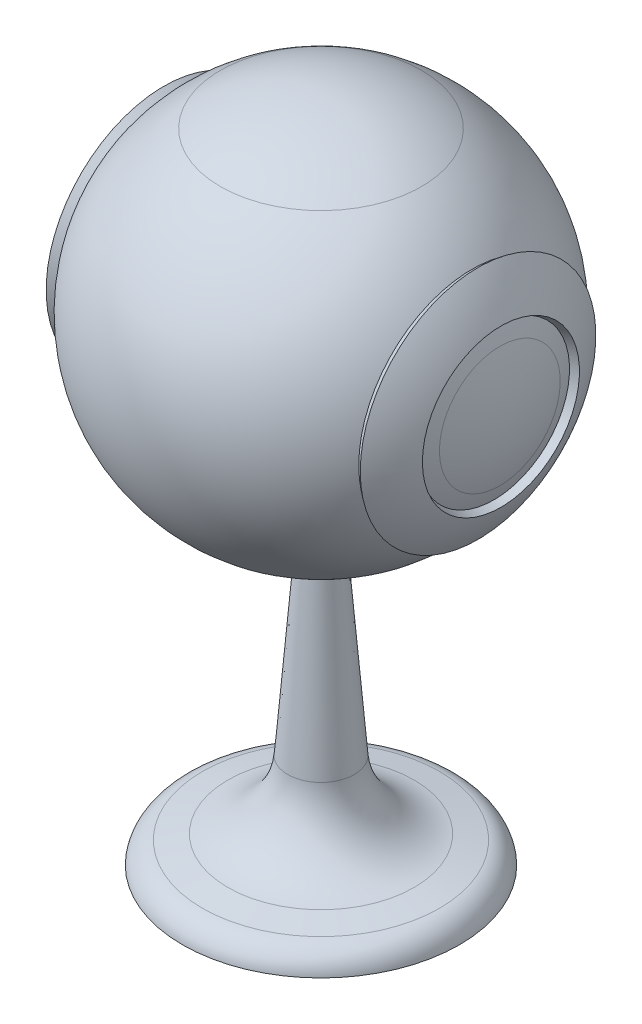
ISO-10303-21;
HEADER;
FILE_DESCRIPTION(('STEP AP214'),'2;1');
FILE_NAME('part.step','',(''),(''),'','','');
FILE_SCHEMA(('AUTOMOTIVE_DESIGN { 1 0 10303 214 1 1 1 1 }'));
ENDSEC;
DATA;
#1=APPLICATION_CONTEXT('core data for automotive mechanical design processes');
#2=APPLICATION_PROTOCOL_DEFINITION('international standard','automotive_design',2000,#1);
#3=PRODUCT_CONTEXT('',#1,'mechanical');
#4=PRODUCT('Part','Part','',(#3));
#5=PRODUCT_RELATED_PRODUCT_CATEGORY('part','',(#4));
#6=PRODUCT_DEFINITION_FORMATION('','',#4);
#7=PRODUCT_DEFINITION_CONTEXT('part definition',#1,'design');
#8=PRODUCT_DEFINITION('design','',#6,#7);
#9=PRODUCT_DEFINITION_SHAPE('','',#8);
#10=(LENGTH_UNIT() NAMED_UNIT(*) SI_UNIT(.MILLI.,.METRE.));
#11=(NAMED_UNIT(*) PLANE_ANGLE_UNIT() SI_UNIT($,.RADIAN.));
#12=(NAMED_UNIT(*) SI_UNIT($,.STERADIAN.) SOLID_ANGLE_UNIT());
#13=UNCERTAINTY_MEASURE_WITH_UNIT(LENGTH_MEASURE(1.E-05),#10,'distance_accuracy_value','');
#14=(GEOMETRIC_REPRESENTATION_CONTEXT(3) GLOBAL_UNCERTAINTY_ASSIGNED_CONTEXT((#13)) GLOBAL_UNIT_ASSIGNED_CONTEXT((#10,
#11,#12)) REPRESENTATION_CONTEXT('',''));
#15=CARTESIAN_POINT('',(0.,0.,0.));
#16=DIRECTION('',(0.,0.,1.));
#17=DIRECTION('',(1.,0.,0.));
#18=AXIS2_PLACEMENT_3D('',#15,#16,#17);
#19=CARTESIAN_POINT('',(-24.96,0.,0.));
#20=DIRECTION('',(-1.,0.,0.));
#21=DIRECTION('',(0.,0.,1.));
#22=AXIS2_PLACEMENT_3D('',#19,#20,#21);
#23=CONICAL_SURFACE('',#22,18.72,0.643501108793285);
#24=CARTESIAN_POINT('',(-24.,0.,0.));
#25=DIRECTION('',(1.,0.,0.));
#26=DIRECTION('',(0.,0.,-1.));
#27=AXIS2_PLACEMENT_3D('',#24,#25,#26);
#28=CIRCLE('',#27,18.);
#29=CARTESIAN_POINT('',(-24.,0.,-18.));
#30=VERTEX_POINT('',#29);
#31=EDGE_CURVE('E62',#30,#30,#28,.F.);
#32=ORIENTED_EDGE('',*,*,#31,.T.);
#33=EDGE_LOOP('',(#32));
#34=FACE_BOUND('',#33,.T.);
#35=CARTESIAN_POINT('',(-24.96,0.,0.));
#36=DIRECTION('',(1.,0.,0.));
#37=DIRECTION('',(0.,0.,-1.));
#38=AXIS2_PLACEMENT_3D('',#35,#36,#37);
#39=CIRCLE('',#38,18.72);
#40=CARTESIAN_POINT('',(-24.96,0.,-18.72));
#41=VERTEX_POINT('',#40);
#42=EDGE_CURVE('E68',#41,#41,#39,.F.);
#43=ORIENTED_EDGE('',*,*,#42,.F.);
#44=EDGE_LOOP('',(#43));
#45=FACE_BOUND('',#44,.T.);
#46=ADVANCED_FACE('F54',(#34,#45),#23,.T.);
#47=CARTESIAN_POINT('',(-28.5952723365244,0.,0.));
#48=DIRECTION('',(-1.,0.,0.));
#49=DIRECTION('',(0.,0.,1.));
#50=AXIS2_PLACEMENT_3D('',#47,#48,#49);
#51=CONICAL_SURFACE('',#50,12.48,0.411516846067488);
#52=CARTESIAN_POINT('',(-27.495454169735,0.,0.));
#53=DIRECTION('',(1.,0.,0.));
#54=DIRECTION('',(0.,0.,-1.));
#55=AXIS2_PLACEMENT_3D('',#52,#53,#54);
#56=CIRCLE('',#55,12.);
#57=CARTESIAN_POINT('',(-27.495454169735,0.,-12.));
#58=VERTEX_POINT('',#57);
#59=EDGE_CURVE('E11',#58,#58,#56,.F.);
#60=ORIENTED_EDGE('',*,*,#59,.F.);
#61=EDGE_LOOP('',(#60));
#62=FACE_BOUND('',#61,.T.);
#63=CARTESIAN_POINT('',(-28.5952723365244,0.,0.));
#64=DIRECTION('',(1.,0.,0.));
#65=DIRECTION('',(0.,0.,-1.));
#66=AXIS2_PLACEMENT_3D('',#63,#64,#65);
#67=CIRCLE('',#66,12.48);
#68=CARTESIAN_POINT('',(-28.5952723365244,0.,-12.48));
#69=VERTEX_POINT('',#68);
#70=EDGE_CURVE('E58',#69,#69,#67,.F.);
#71=ORIENTED_EDGE('',*,*,#70,.T.);
#72=EDGE_LOOP('',(#71));
#73=FACE_BOUND('',#72,.T.);
#74=ADVANCED_FACE('F56',(#62,#73),#51,.F.);
#75=CARTESIAN_POINT('',(0.,0.,0.));
#76=DIRECTION('',(0.,-1.,0.));
#77=DIRECTION('',(0.,0.,-1.));
#78=AXIS2_PLACEMENT_3D('',#75,#76,#77);
#79=SPHERICAL_SURFACE('',#78,30.);
#80=CARTESIAN_POINT('',(0.,0.,0.));
#81=DIRECTION('',(1.,0.,0.));
#82=DIRECTION('',(0.,0.,-1.));
#83=AXIS2_PLACEMENT_3D('',#80,#81,#82);
#84=SPHERICAL_SURFACE('',#83,30.);
#85=ORIENTED_EDGE('',*,*,#31,.F.);
#86=EDGE_LOOP('',(#85));
#87=FACE_BOUND('',#86,.T.);
#88=ORIENTED_EDGE('',*,*,#59,.T.);
#89=EDGE_LOOP('',(#88));
#90=FACE_BOUND('',#89,.T.);
#91=ADVANCED_FACE('F78',(#87,#90),#84,.F.);
#92=CARTESIAN_POINT('',(0.,0.,0.));
#93=DIRECTION('',(0.,-1.,0.));
#94=DIRECTION('',(0.,0.,-1.));
#95=AXIS2_PLACEMENT_3D('',#92,#93,#94);
#96=SPHERICAL_SURFACE('',#95,31.2);
#97=CARTESIAN_POINT('',(0.,0.,0.));
#98=DIRECTION('',(1.,0.,0.));
#99=DIRECTION('',(0.,0.,-1.));
#100=AXIS2_PLACEMENT_3D('',#97,#98,#99);
#101=SPHERICAL_SURFACE('',#100,31.2);
#102=ORIENTED_EDGE('',*,*,#42,.T.);
#103=EDGE_LOOP('',(#102));
#104=FACE_BOUND('',#103,.T.);
#105=ORIENTED_EDGE('',*,*,#70,.F.);
#106=EDGE_LOOP('',(#105));
#107=FACE_BOUND('',#106,.T.);
#108=ADVANCED_FACE('F76',(#104,#107),#101,.T.);
#109=CLOSED_SHELL('',(#46,#74,#91,#108));
#110=MANIFOLD_SOLID_BREP('B2',#109);
#111=CARTESIAN_POINT('',(0.,-76.,-22.));
#112=DIRECTION('',(0.,1.,0.));
#113=DIRECTION('',(0.,0.,1.));
#114=AXIS2_PLACEMENT_3D('',#111,#112,#113);
#115=PLANE('',#114);
#116=CARTESIAN_POINT('',(0.,-76.,0.));
#117=DIRECTION('',(0.,1.,0.));
#118=DIRECTION('',(0.,0.,1.));
#119=AXIS2_PLACEMENT_3D('',#116,#117,#118);
#120=CIRCLE('',#119,22.);
#121=CARTESIAN_POINT('',(0.,-76.,22.));
#122=VERTEX_POINT('',#121);
#123=EDGE_CURVE('E158',#122,#122,#120,.T.);
#124=ORIENTED_EDGE('',*,*,#123,.F.);
#125=EDGE_LOOP('',(#124));
#126=FACE_BOUND('',#125,.T.);
#127=ADVANCED_FACE('F138',(#126),#115,.F.);
#128=CARTESIAN_POINT('',(0.,-73.2,0.));
#129=DIRECTION('',(0.,-1.,0.));
#130=DIRECTION('',(0.,0.,-1.));
#131=AXIS2_PLACEMENT_3D('',#128,#129,#130);
#132=CONICAL_SURFACE('',#131,22.,1.36554355560098);
#133=CARTESIAN_POINT('',(0.,-71.7009181001644,0.));
#134=DIRECTION('',(0.,-1.,0.));
#135=DIRECTION('',(0.,0.,-1.));
#136=AXIS2_PLACEMENT_3D('',#133,#134,#135);
#137=CIRCLE('',#136,14.7992637027171);
#138=CARTESIAN_POINT('',(0.,-71.7009181001644,-14.7992637027171));
#139=VERTEX_POINT('',#138);
#140=EDGE_CURVE('E52',#139,#139,#137,.T.);
#141=ORIENTED_EDGE('',*,*,#140,.T.);
#142=EDGE_LOOP('',(#141));
#143=FACE_BOUND('',#142,.T.);
#144=CARTESIAN_POINT('',(0.,-72.5424751252405,0.));
#145=DIRECTION('',(0.,1.,0.));
#146=DIRECTION('',(0.,0.,1.));
#147=AXIS2_PLACEMENT_3D('',#144,#145,#146);
#148=CIRCLE('',#147,18.8416247087192);
#149=CARTESIAN_POINT('',(0.,-72.5424751252405,18.8416247087192));
#150=VERTEX_POINT('',#149);
#151=EDGE_CURVE('E161',#150,#150,#148,.T.);
#152=ORIENTED_EDGE('',*,*,#151,.T.);
#153=EDGE_LOOP('',(#152));
#154=FACE_BOUND('',#153,.T.);
#155=ADVANCED_FACE('F177',(#143,#154),#132,.T.);
#156=CARTESIAN_POINT('',(0.,-69.8690475241512,0.));
#157=DIRECTION('',(0.,-1.,0.));
#158=DIRECTION('',(0.,0.,-1.));
#159=AXIS2_PLACEMENT_3D('',#156,#157,#158);
#160=CONICAL_SURFACE('',#159,6.00000000000001,0.0798299857122373);
#161=CARTESIAN_POINT('',(0.,-60.9097467996196,0.));
#162=DIRECTION('',(0.,-1.,0.));
#163=DIRECTION('',(0.,0.,-1.));
#164=AXIS2_PLACEMENT_3D('',#161,#162,#163);
#165=CIRCLE('',#164,5.28325594203748);
#166=CARTESIAN_POINT('',(0.,-60.9097467996196,-5.28325594203748));
#167=VERTEX_POINT('',#166);
#168=EDGE_CURVE('E145',#167,#167,#165,.F.);
#169=ORIENTED_EDGE('',*,*,#168,.T.);
#170=EDGE_LOOP('',(#169));
#171=FACE_BOUND('',#170,.T.);
#172=CARTESIAN_POINT('',(0.,-29.8690475241511,0.));
#173=DIRECTION('',(0.,1.,0.));
#174=DIRECTION('',(0.,0.,1.));
#175=AXIS2_PLACEMENT_3D('',#172,#173,#174);
#176=CIRCLE('',#175,2.80000000000001);
#177=CARTESIAN_POINT('',(0.,-29.8690475241511,2.80000000000001));
#178=VERTEX_POINT('',#177);
#179=EDGE_CURVE('E156',#178,#178,#176,.T.);
#180=ORIENTED_EDGE('',*,*,#179,.F.);
#181=EDGE_LOOP('',(#180));
#182=FACE_BOUND('',#181,.T.);
#183=ADVANCED_FACE('F152',(#171,#182),#160,.T.);
#184=CARTESIAN_POINT('',(0.,-29.8690475241511,0.));
#185=DIRECTION('',(0.,1.,0.));
#186=DIRECTION('',(0.,0.,1.));
#187=AXIS2_PLACEMENT_3D('',#184,#185,#186);
#188=CONICAL_SURFACE('',#187,2.80000000000001,1.52406164006435);
#189=CARTESIAN_POINT('',(0.,-30.,0.));
#190=VERTEX_POINT('',#189);
#191=VERTEX_LOOP('',#190);
#192=FACE_BOUND('',#191,.T.);
#193=ORIENTED_EDGE('',*,*,#179,.T.);
#194=EDGE_LOOP('',(#193));
#195=FACE_BOUND('',#194,.T.);
#196=ADVANCED_FACE('F148',(#192,#195),#188,.F.);
#197=CARTESIAN_POINT('',(0.,-76.4585131145537,0.));
#198=DIRECTION('',(0.,-1.,0.));
#199=DIRECTION('',(0.,0.,-1.));
#200=AXIS2_PLACEMENT_3D('',#197,#198,#199);
#201=TOROIDAL_SURFACE('',#200,18.0263661814679,4.);
#202=ORIENTED_EDGE('',*,*,#123,.T.);
#203=EDGE_LOOP('',(#202));
#204=FACE_BOUND('',#203,.T.);
#205=ORIENTED_EDGE('',*,*,#151,.F.);
#206=EDGE_LOOP('',(#205));
#207=FACE_BOUND('',#206,.T.);
#208=ADVANCED_FACE('F151',(#204,#207),#201,.T.);
#209=CARTESIAN_POINT('',(0.,-59.9528041322249,0.));
#210=DIRECTION('',(0.,1.,0.));
#211=DIRECTION('',(0.,0.,1.));
#212=AXIS2_PLACEMENT_3D('',#209,#210,#211);
#213=TOROIDAL_SURFACE('',#212,17.245039284471,12.);
#214=ORIENTED_EDGE('',*,*,#140,.F.);
#215=EDGE_LOOP('',(#214));
#216=FACE_BOUND('',#215,.T.);
#217=ORIENTED_EDGE('',*,*,#168,.F.);
#218=EDGE_LOOP('',(#217));
#219=FACE_BOUND('',#218,.T.);
#220=ADVANCED_FACE('F140',(#216,#219),#213,.F.);
#221=CLOSED_SHELL('',(#127,#155,#183,#196,#208,#220));
#222=MANIFOLD_SOLID_BREP('B6',#221);
#223=CARTESIAN_POINT('',(24.96,0.,0.));
#224=DIRECTION('',(1.,0.,0.));
#225=DIRECTION('',(0.,0.,-1.));
#226=AXIS2_PLACEMENT_3D('',#223,#224,#225);
#227=CONICAL_SURFACE('',#226,18.72,0.643501108793285);
#228=CARTESIAN_POINT('',(24.,0.,0.));
#229=DIRECTION('',(-1.,0.,0.));
#230=DIRECTION('',(0.,0.,1.));
#231=AXIS2_PLACEMENT_3D('',#228,#229,#230);
#232=CIRCLE('',#231,18.);
#233=CARTESIAN_POINT('',(24.,0.,18.));
#234=VERTEX_POINT('',#233);
#235=EDGE_CURVE('E251',#234,#234,#232,.F.);
#236=ORIENTED_EDGE('',*,*,#235,.T.);
#237=EDGE_LOOP('',(#236));
#238=FACE_BOUND('',#237,.T.);
#239=CARTESIAN_POINT('',(24.96,0.,0.));
#240=DIRECTION('',(-1.,0.,0.));
#241=DIRECTION('',(0.,0.,1.));
#242=AXIS2_PLACEMENT_3D('',#239,#240,#241);
#243=CIRCLE('',#242,18.72);
#244=CARTESIAN_POINT('',(24.96,0.,18.72));
#245=VERTEX_POINT('',#244);
#246=EDGE_CURVE('E257',#245,#245,#243,.F.);
#247=ORIENTED_EDGE('',*,*,#246,.F.);
#248=EDGE_LOOP('',(#247));
#249=FACE_BOUND('',#248,.T.);
#250=ADVANCED_FACE('F243',(#238,#249),#227,.T.);
#251=CARTESIAN_POINT('',(28.5952723365244,0.,0.));
#252=DIRECTION('',(1.,0.,0.));
#253=DIRECTION('',(0.,0.,-1.));
#254=AXIS2_PLACEMENT_3D('',#251,#252,#253);
#255=CONICAL_SURFACE('',#254,12.48,0.411516846067488);
#256=CARTESIAN_POINT('',(27.495454169735,0.,0.));
#257=DIRECTION('',(-1.,0.,0.));
#258=DIRECTION('',(0.,0.,1.));
#259=AXIS2_PLACEMENT_3D('',#256,#257,#258);
#260=CIRCLE('',#259,12.);
#261=CARTESIAN_POINT('',(27.495454169735,0.,12.));
#262=VERTEX_POINT('',#261);
#263=EDGE_CURVE('E137',#262,#262,#260,.F.);
#264=ORIENTED_EDGE('',*,*,#263,.F.);
#265=EDGE_LOOP('',(#264));
#266=FACE_BOUND('',#265,.T.);
#267=CARTESIAN_POINT('',(28.5952723365244,0.,0.));
#268=DIRECTION('',(-1.,0.,0.));
#269=DIRECTION('',(0.,0.,1.));
#270=AXIS2_PLACEMENT_3D('',#267,#268,#269);
#271=CIRCLE('',#270,12.48);
#272=CARTESIAN_POINT('',(28.5952723365244,0.,12.48));
#273=VERTEX_POINT('',#272);
#274=EDGE_CURVE('E247',#273,#273,#271,.F.);
#275=ORIENTED_EDGE('',*,*,#274,.T.);
#276=EDGE_LOOP('',(#275));
#277=FACE_BOUND('',#276,.T.);
#278=ADVANCED_FACE('F245',(#266,#277),#255,.F.);
#279=CARTESIAN_POINT('',(0.,0.,0.));
#280=DIRECTION('',(0.,-1.,0.));
#281=DIRECTION('',(0.,0.,-1.));
#282=AXIS2_PLACEMENT_3D('',#279,#280,#281);
#283=SPHERICAL_SURFACE('',#282,30.);
#284=CARTESIAN_POINT('',(0.,0.,0.));
#285=DIRECTION('',(-1.,0.,0.));
#286=DIRECTION('',(0.,0.,1.));
#287=AXIS2_PLACEMENT_3D('',#284,#285,#286);
#288=SPHERICAL_SURFACE('',#287,30.);
#289=ORIENTED_EDGE('',*,*,#235,.F.);
#290=EDGE_LOOP('',(#289));
#291=FACE_BOUND('',#290,.T.);
#292=ORIENTED_EDGE('',*,*,#263,.T.);
#293=EDGE_LOOP('',(#292));
#294=FACE_BOUND('',#293,.T.);
#295=ADVANCED_FACE('F267',(#291,#294),#288,.F.);
#296=CARTESIAN_POINT('',(0.,0.,0.));
#297=DIRECTION('',(0.,-1.,0.));
#298=DIRECTION('',(0.,0.,-1.));
#299=AXIS2_PLACEMENT_3D('',#296,#297,#298);
#300=SPHERICAL_SURFACE('',#299,31.2);
#301=CARTESIAN_POINT('',(0.,0.,0.));
#302=DIRECTION('',(-1.,0.,0.));
#303=DIRECTION('',(0.,0.,1.));
#304=AXIS2_PLACEMENT_3D('',#301,#302,#303);
#305=SPHERICAL_SURFACE('',#304,31.2);
#306=ORIENTED_EDGE('',*,*,#246,.T.);
#307=EDGE_LOOP('',(#306));
#308=FACE_BOUND('',#307,.T.);
#309=ORIENTED_EDGE('',*,*,#274,.F.);
#310=EDGE_LOOP('',(#309));
#311=FACE_BOUND('',#310,.T.);
#312=ADVANCED_FACE('F265',(#308,#311),#305,.T.);
#313=CLOSED_SHELL('',(#250,#278,#295,#312));
#314=MANIFOLD_SOLID_BREP('B46',#313);
#315=CARTESIAN_POINT('',(0.,0.,0.));
#316=DIRECTION('',(0.,-1.,0.));
#317=DIRECTION('',(0.,0.,-1.));
#318=AXIS2_PLACEMENT_3D('',#315,#316,#317);
#319=SPHERICAL_SURFACE('',#318,30.);
#320=CARTESIAN_POINT('',(0.,25.377155080899,0.));
#321=DIRECTION('',(0.,-1.,0.));
#322=DIRECTION('',(0.,0.,-1.));
#323=AXIS2_PLACEMENT_3D('',#320,#321,#322);
#324=CIRCLE('',#323,16.);
#325=CARTESIAN_POINT('',(0.,25.377155080899,-16.));
#326=VERTEX_POINT('',#325);
#327=EDGE_CURVE('E242',#326,#326,#324,.T.);
#328=ORIENTED_EDGE('',*,*,#327,.T.);
#329=EDGE_LOOP('',(#328));
#330=FACE_BOUND('',#329,.T.);
#331=ADVANCED_FACE('F330',(#330),#319,.F.);
#332=CARTESIAN_POINT('',(0.,0.,0.));
#333=DIRECTION('',(1.,0.,0.));
#334=DIRECTION('',(0.,0.,-1.));
#335=AXIS2_PLACEMENT_3D('',#332,#333,#334);
#336=SPHERICAL_SURFACE('',#335,30.);
#337=CARTESIAN_POINT('',(-27.495454169735,0.,0.));
#338=DIRECTION('',(1.,0.,0.));
#339=DIRECTION('',(0.,0.,-1.));
#340=AXIS2_PLACEMENT_3D('',#337,#338,#339);
#341=CIRCLE('',#340,12.);
#342=CARTESIAN_POINT('',(-27.495454169735,0.,-12.));
#343=VERTEX_POINT('',#342);
#344=EDGE_CURVE('E351',#343,#343,#341,.F.);
#345=ORIENTED_EDGE('',*,*,#344,.F.);
#346=EDGE_LOOP('',(#345));
#347=FACE_BOUND('',#346,.T.);
#348=CARTESIAN_POINT('',(-28.4225262775848,0.,0.));
#349=DIRECTION('',(1.,0.,0.));
#350=DIRECTION('',(0.,0.,-1.));
#351=AXIS2_PLACEMENT_3D('',#348,#349,#350);
#352=CIRCLE('',#351,9.6);
#353=CARTESIAN_POINT('',(-28.4225262775848,0.,-9.6));
#354=VERTEX_POINT('',#353);
#355=EDGE_CURVE('E336',#354,#354,#352,.F.);
#356=ORIENTED_EDGE('',*,*,#355,.T.);
#357=EDGE_LOOP('',(#356));
#358=FACE_BOUND('',#357,.T.);
#359=ADVANCED_FACE('F381',(#347,#358),#336,.F.);
#360=CARTESIAN_POINT('',(0.,0.,0.));
#361=DIRECTION('',(-1.,0.,0.));
#362=DIRECTION('',(0.,0.,1.));
#363=AXIS2_PLACEMENT_3D('',#360,#361,#362);
#364=SPHERICAL_SURFACE('',#363,30.);
#365=CARTESIAN_POINT('',(27.495454169735,0.,0.));
#366=DIRECTION('',(-1.,0.,0.));
#367=DIRECTION('',(0.,0.,1.));
#368=AXIS2_PLACEMENT_3D('',#365,#366,#367);
#369=CIRCLE('',#368,12.);
#370=CARTESIAN_POINT('',(27.495454169735,0.,12.));
#371=VERTEX_POINT('',#370);
#372=EDGE_CURVE('E353',#371,#371,#369,.F.);
#373=ORIENTED_EDGE('',*,*,#372,.F.);
#374=EDGE_LOOP('',(#373));
#375=FACE_BOUND('',#374,.T.);
#376=CARTESIAN_POINT('',(28.4225262775848,0.,0.));
#377=DIRECTION('',(-1.,0.,0.));
#378=DIRECTION('',(0.,0.,1.));
#379=AXIS2_PLACEMENT_3D('',#376,#377,#378);
#380=CIRCLE('',#379,9.6);
#381=CARTESIAN_POINT('',(28.4225262775848,0.,9.6));
#382=VERTEX_POINT('',#381);
#383=EDGE_CURVE('E343',#382,#382,#380,.F.);
#384=ORIENTED_EDGE('',*,*,#383,.T.);
#385=EDGE_LOOP('',(#384));
#386=FACE_BOUND('',#385,.T.);
#387=ADVANCED_FACE('F377',(#375,#386),#364,.F.);
#388=CARTESIAN_POINT('',(0.,0.,0.));
#389=DIRECTION('',(1.,0.,0.));
#390=DIRECTION('',(0.,0.,-1.));
#391=AXIS2_PLACEMENT_3D('',#388,#389,#390);
#392=SPHERICAL_SURFACE('',#391,30.);
#393=CARTESIAN_POINT('',(-24.,0.,0.));
#394=DIRECTION('',(1.,0.,0.));
#395=DIRECTION('',(0.,0.,-1.));
#396=AXIS2_PLACEMENT_3D('',#393,#394,#395);
#397=CIRCLE('',#396,18.);
#398=CARTESIAN_POINT('',(-24.,0.,-18.));
#399=VERTEX_POINT('',#398);
#400=EDGE_CURVE('E357',#399,#399,#397,.F.);
#401=ORIENTED_EDGE('',*,*,#400,.F.);
#402=EDGE_LOOP('',(#401));
#403=FACE_BOUND('',#402,.T.);
#404=ORIENTED_EDGE('',*,*,#344,.T.);
#405=EDGE_LOOP('',(#404));
#406=FACE_BOUND('',#405,.T.);
#407=ADVANCED_FACE('F373',(#403,#406),#392,.F.);
#408=CARTESIAN_POINT('',(0.,0.,0.));
#409=DIRECTION('',(-1.,0.,0.));
#410=DIRECTION('',(0.,0.,1.));
#411=AXIS2_PLACEMENT_3D('',#408,#409,#410);
#412=SPHERICAL_SURFACE('',#411,30.);
#413=CARTESIAN_POINT('',(24.,0.,0.));
#414=DIRECTION('',(-1.,0.,0.));
#415=DIRECTION('',(0.,0.,1.));
#416=AXIS2_PLACEMENT_3D('',#413,#414,#415);
#417=CIRCLE('',#416,18.);
#418=CARTESIAN_POINT('',(24.,0.,18.));
#419=VERTEX_POINT('',#418);
#420=EDGE_CURVE('E361',#419,#419,#417,.F.);
#421=ORIENTED_EDGE('',*,*,#420,.F.);
#422=EDGE_LOOP('',(#421));
#423=FACE_BOUND('',#422,.T.);
#424=ORIENTED_EDGE('',*,*,#372,.T.);
#425=EDGE_LOOP('',(#424));
#426=FACE_BOUND('',#425,.T.);
#427=ADVANCED_FACE('F376',(#423,#426),#412,.F.);
#428=ORIENTED_EDGE('',*,*,#327,.F.);
#429=EDGE_LOOP('',(#428));
#430=FACE_BOUND('',#429,.T.);
#431=ORIENTED_EDGE('',*,*,#420,.T.);
#432=EDGE_LOOP('',(#431));
#433=FACE_BOUND('',#432,.T.);
#434=ORIENTED_EDGE('',*,*,#400,.T.);
#435=EDGE_LOOP('',(#434));
#436=FACE_BOUND('',#435,.T.);
#437=ADVANCED_FACE('F371',(#430,#433,#436),#319,.F.);
#438=CARTESIAN_POINT('',(0.,0.,0.));
#439=DIRECTION('',(1.,0.,0.));
#440=DIRECTION('',(0.,0.,-1.));
#441=AXIS2_PLACEMENT_3D('',#438,#439,#440);
#442=SPHERICAL_SURFACE('',#441,30.);
#443=ORIENTED_EDGE('',*,*,#355,.F.);
#444=EDGE_LOOP('',(#443));
#445=FACE_BOUND('',#444,.T.);
#446=ADVANCED_FACE('F391',(#445),#442,.F.);
#447=CARTESIAN_POINT('',(0.,0.,0.));
#448=DIRECTION('',(-1.,0.,0.));
#449=DIRECTION('',(0.,0.,1.));
#450=AXIS2_PLACEMENT_3D('',#447,#448,#449);
#451=SPHERICAL_SURFACE('',#450,30.);
#452=ORIENTED_EDGE('',*,*,#383,.F.);
#453=EDGE_LOOP('',(#452));
#454=FACE_BOUND('',#453,.T.);
#455=ADVANCED_FACE('F331',(#454),#451,.F.);
#456=OPEN_SHELL('',(#331,#359,#387,#407,#427,#437,#446,#455));
#457=SHELL_BASED_SURFACE_MODEL('B132',(#456));
#458=ADVANCED_BREP_SHAPE_REPRESENTATION('',(#18,#110,#222,#314),#14);
#459=MANIFOLD_SURFACE_SHAPE_REPRESENTATION('',(#18,#457),#14);
#460=SHAPE_REPRESENTATION('',(#18),#14);
#461=SHAPE_DEFINITION_REPRESENTATION(#9,#460);
#462=SHAPE_REPRESENTATION_RELATIONSHIP('','',#460,#458);
#463=SHAPE_REPRESENTATION_RELATIONSHIP('','',#460,#459);
ENDSEC;
END-ISO-10303-21;
